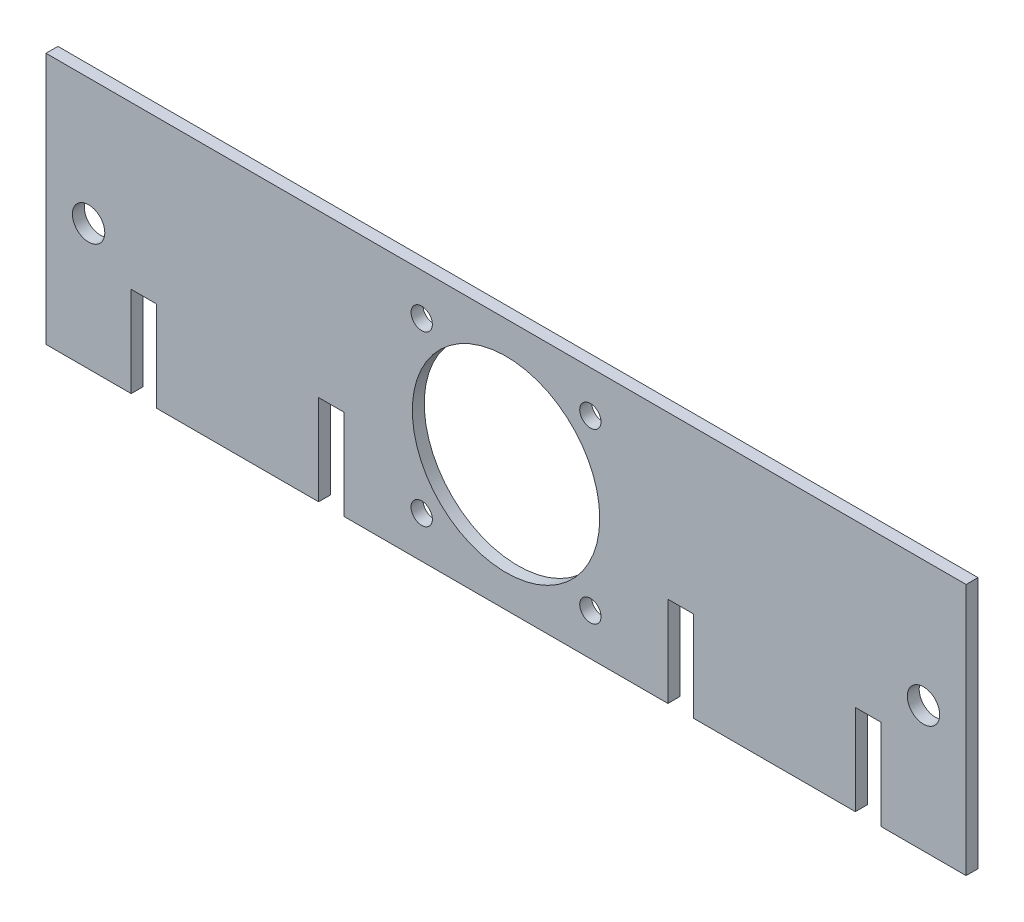
ISO-10303-21;
HEADER;
FILE_DESCRIPTION(('STEP AP214'),'2;1');
FILE_NAME('part.step','',(''),(''),'','','');
FILE_SCHEMA(('AUTOMOTIVE_DESIGN { 1 0 10303 214 1 1 1 1 }'));
ENDSEC;
DATA;
#1=APPLICATION_CONTEXT('core data for automotive mechanical design processes');
#2=APPLICATION_PROTOCOL_DEFINITION('international standard','automotive_design',2000,#1);
#3=PRODUCT_CONTEXT('',#1,'mechanical');
#4=PRODUCT('Part','Part','',(#3));
#5=PRODUCT_RELATED_PRODUCT_CATEGORY('part','',(#4));
#6=PRODUCT_DEFINITION_FORMATION('','',#4);
#7=PRODUCT_DEFINITION_CONTEXT('part definition',#1,'design');
#8=PRODUCT_DEFINITION('design','',#6,#7);
#9=PRODUCT_DEFINITION_SHAPE('','',#8);
#10=(LENGTH_UNIT() NAMED_UNIT(*) SI_UNIT(.MILLI.,.METRE.));
#11=(NAMED_UNIT(*) PLANE_ANGLE_UNIT() SI_UNIT($,.RADIAN.));
#12=(NAMED_UNIT(*) SI_UNIT($,.STERADIAN.) SOLID_ANGLE_UNIT());
#13=UNCERTAINTY_MEASURE_WITH_UNIT(LENGTH_MEASURE(1.E-05),#10,'distance_accuracy_value','');
#14=(GEOMETRIC_REPRESENTATION_CONTEXT(3) GLOBAL_UNCERTAINTY_ASSIGNED_CONTEXT((#13)) GLOBAL_UNIT_ASSIGNED_CONTEXT((#10,
#11,#12)) REPRESENTATION_CONTEXT('',''));
#15=CARTESIAN_POINT('',(0.,0.,0.));
#16=DIRECTION('',(0.,0.,1.));
#17=DIRECTION('',(1.,0.,0.));
#18=AXIS2_PLACEMENT_3D('',#15,#16,#17);
#19=CARTESIAN_POINT('',(19.,-4.2,2.4));
#20=DIRECTION('',(0.,-1.,0.));
#21=DIRECTION('',(-1.,0.,0.));
#22=AXIS2_PLACEMENT_3D('',#19,#20,#21);
#23=PLANE('',#22);
#24=DIRECTION('',(0.,0.,1.));
#25=VECTOR('',#24,1.);
#26=CARTESIAN_POINT('',(19.,-4.2,2.4));
#27=LINE('',#26,#25);
#28=CARTESIAN_POINT('',(19.,-4.2,1.));
#29=VERTEX_POINT('',#28);
#30=CARTESIAN_POINT('',(19.,-4.2,2.4));
#31=VERTEX_POINT('',#30);
#32=EDGE_CURVE('E11',#29,#31,#27,.T.);
#33=ORIENTED_EDGE('',*,*,#32,.F.);
#34=DIRECTION('',(-1.,0.,0.));
#35=VECTOR('',#34,1.);
#36=CARTESIAN_POINT('',(54.,-4.2,1.));
#37=LINE('',#36,#35);
#38=CARTESIAN_POINT('',(22.,-4.2,1.));
#39=VERTEX_POINT('',#38);
#40=EDGE_CURVE('E138',#39,#29,#37,.T.);
#41=ORIENTED_EDGE('',*,*,#40,.F.);
#42=DIRECTION('',(0.,0.,1.));
#43=VECTOR('',#42,1.);
#44=CARTESIAN_POINT('',(22.,-4.2,2.4));
#45=LINE('',#44,#43);
#46=CARTESIAN_POINT('',(22.,-4.2,2.4));
#47=VERTEX_POINT('',#46);
#48=EDGE_CURVE('E43',#39,#47,#45,.T.);
#49=ORIENTED_EDGE('',*,*,#48,.T.);
#50=DIRECTION('',(-1.,0.,0.));
#51=VECTOR('',#50,1.);
#52=CARTESIAN_POINT('',(19.,-4.2,2.4));
#53=LINE('',#52,#51);
#54=EDGE_CURVE('E269',#47,#31,#53,.T.);
#55=ORIENTED_EDGE('',*,*,#54,.T.);
#56=EDGE_LOOP('',(#33,#41,#49,#55));
#57=FACE_BOUND('',#56,.T.);
#58=ADVANCED_FACE('F33',(#57),#23,.T.);
#59=CARTESIAN_POINT('',(22.,-4.2,2.4));
#60=DIRECTION('',(-1.,0.,0.));
#61=DIRECTION('',(0.,1.,0.));
#62=AXIS2_PLACEMENT_3D('',#59,#60,#61);
#63=PLANE('',#62);
#64=ORIENTED_EDGE('',*,*,#48,.F.);
#65=DIRECTION('',(0.,1.,0.));
#66=VECTOR('',#65,1.);
#67=CARTESIAN_POINT('',(22.,14.8,1.));
#68=LINE('',#67,#66);
#69=CARTESIAN_POINT('',(22.,-14.8,1.));
#70=VERTEX_POINT('',#69);
#71=EDGE_CURVE('E193',#70,#39,#68,.T.);
#72=ORIENTED_EDGE('',*,*,#71,.F.);
#73=DIRECTION('',(0.,0.,1.));
#74=VECTOR('',#73,1.);
#75=CARTESIAN_POINT('',(22.,-14.8,2.4));
#76=LINE('',#75,#74);
#77=CARTESIAN_POINT('',(22.,-14.8,2.4));
#78=VERTEX_POINT('',#77);
#79=EDGE_CURVE('E262',#70,#78,#76,.T.);
#80=ORIENTED_EDGE('',*,*,#79,.T.);
#81=DIRECTION('',(0.,1.,0.));
#82=VECTOR('',#81,1.);
#83=CARTESIAN_POINT('',(22.,-4.2,2.4));
#84=LINE('',#83,#82);
#85=EDGE_CURVE('E280',#78,#47,#84,.T.);
#86=ORIENTED_EDGE('',*,*,#85,.T.);
#87=EDGE_LOOP('',(#64,#72,#80,#86));
#88=FACE_BOUND('',#87,.T.);
#89=ADVANCED_FACE('F283',(#88),#63,.T.);
#90=CARTESIAN_POINT('',(-54.,-14.8,2.4));
#91=DIRECTION('',(0.,1.,0.));
#92=DIRECTION('',(1.,0.,0.));
#93=AXIS2_PLACEMENT_3D('',#90,#91,#92);
#94=PLANE('',#93);
#95=ORIENTED_EDGE('',*,*,#79,.F.);
#96=DIRECTION('',(-1.,0.,0.));
#97=VECTOR('',#96,1.);
#98=CARTESIAN_POINT('',(54.,-14.8,1.));
#99=LINE('',#98,#97);
#100=CARTESIAN_POINT('',(41.,-14.8,1.));
#101=VERTEX_POINT('',#100);
#102=EDGE_CURVE('E190',#70,#101,#99,.F.);
#103=ORIENTED_EDGE('',*,*,#102,.T.);
#104=DIRECTION('',(0.,0.,1.));
#105=VECTOR('',#104,1.);
#106=CARTESIAN_POINT('',(41.,-14.8,2.4));
#107=LINE('',#106,#105);
#108=CARTESIAN_POINT('',(41.,-14.8,2.4));
#109=VERTEX_POINT('',#108);
#110=EDGE_CURVE('E259',#101,#109,#107,.T.);
#111=ORIENTED_EDGE('',*,*,#110,.T.);
#112=DIRECTION('',(1.,0.,0.));
#113=VECTOR('',#112,1.);
#114=CARTESIAN_POINT('',(-54.,-14.8,2.4));
#115=LINE('',#114,#113);
#116=EDGE_CURVE('E284',#78,#109,#115,.T.);
#117=ORIENTED_EDGE('',*,*,#116,.F.);
#118=EDGE_LOOP('',(#95,#103,#111,#117));
#119=FACE_BOUND('',#118,.T.);
#120=ADVANCED_FACE('F364',(#119),#94,.F.);
#121=CARTESIAN_POINT('',(41.,-14.8,2.4));
#122=DIRECTION('',(1.,0.,0.));
#123=DIRECTION('',(0.,-1.,0.));
#124=AXIS2_PLACEMENT_3D('',#121,#122,#123);
#125=PLANE('',#124);
#126=ORIENTED_EDGE('',*,*,#110,.F.);
#127=DIRECTION('',(0.,1.,0.));
#128=VECTOR('',#127,1.);
#129=CARTESIAN_POINT('',(41.,14.8,1.));
#130=LINE('',#129,#128);
#131=CARTESIAN_POINT('',(41.,-4.2,1.));
#132=VERTEX_POINT('',#131);
#133=EDGE_CURVE('E187',#132,#101,#130,.F.);
#134=ORIENTED_EDGE('',*,*,#133,.F.);
#135=DIRECTION('',(0.,0.,1.));
#136=VECTOR('',#135,1.);
#137=CARTESIAN_POINT('',(41.,-4.2,2.4));
#138=LINE('',#137,#136);
#139=CARTESIAN_POINT('',(41.,-4.2,2.4));
#140=VERTEX_POINT('',#139);
#141=EDGE_CURVE('E256',#132,#140,#138,.T.);
#142=ORIENTED_EDGE('',*,*,#141,.T.);
#143=DIRECTION('',(0.,-1.,0.));
#144=VECTOR('',#143,1.);
#145=CARTESIAN_POINT('',(41.,-14.8,2.4));
#146=LINE('',#145,#144);
#147=EDGE_CURVE('E286',#140,#109,#146,.T.);
#148=ORIENTED_EDGE('',*,*,#147,.T.);
#149=EDGE_LOOP('',(#126,#134,#142,#148));
#150=FACE_BOUND('',#149,.T.);
#151=ADVANCED_FACE('F559',(#150),#125,.T.);
#152=CARTESIAN_POINT('',(44.,-4.2,2.4));
#153=DIRECTION('',(0.,-1.,0.));
#154=DIRECTION('',(-1.,0.,0.));
#155=AXIS2_PLACEMENT_3D('',#152,#153,#154);
#156=PLANE('',#155);
#157=ORIENTED_EDGE('',*,*,#141,.F.);
#158=DIRECTION('',(-1.,0.,0.));
#159=VECTOR('',#158,1.);
#160=CARTESIAN_POINT('',(54.,-4.2,1.));
#161=LINE('',#160,#159);
#162=CARTESIAN_POINT('',(44.,-4.2,1.));
#163=VERTEX_POINT('',#162);
#164=EDGE_CURVE('E184',#163,#132,#161,.T.);
#165=ORIENTED_EDGE('',*,*,#164,.F.);
#166=DIRECTION('',(0.,0.,1.));
#167=VECTOR('',#166,1.);
#168=CARTESIAN_POINT('',(44.,-4.2,2.4));
#169=LINE('',#168,#167);
#170=CARTESIAN_POINT('',(44.,-4.2,2.4));
#171=VERTEX_POINT('',#170);
#172=EDGE_CURVE('E253',#163,#171,#169,.T.);
#173=ORIENTED_EDGE('',*,*,#172,.T.);
#174=DIRECTION('',(-1.,0.,0.));
#175=VECTOR('',#174,1.);
#176=CARTESIAN_POINT('',(44.,-4.2,2.4));
#177=LINE('',#176,#175);
#178=EDGE_CURVE('E293',#171,#140,#177,.T.);
#179=ORIENTED_EDGE('',*,*,#178,.T.);
#180=EDGE_LOOP('',(#157,#165,#173,#179));
#181=FACE_BOUND('',#180,.T.);
#182=ADVANCED_FACE('F549',(#181),#156,.T.);
#183=CARTESIAN_POINT('',(44.,-14.8,2.4));
#184=DIRECTION('',(-1.,0.,0.));
#185=DIRECTION('',(0.,1.,0.));
#186=AXIS2_PLACEMENT_3D('',#183,#184,#185);
#187=PLANE('',#186);
#188=ORIENTED_EDGE('',*,*,#172,.F.);
#189=DIRECTION('',(0.,1.,0.));
#190=VECTOR('',#189,1.);
#191=CARTESIAN_POINT('',(44.,14.8,1.));
#192=LINE('',#191,#190);
#193=CARTESIAN_POINT('',(44.,-14.8,1.));
#194=VERTEX_POINT('',#193);
#195=EDGE_CURVE('E181',#194,#163,#192,.T.);
#196=ORIENTED_EDGE('',*,*,#195,.F.);
#197=DIRECTION('',(0.,0.,1.));
#198=VECTOR('',#197,1.);
#199=CARTESIAN_POINT('',(44.,-14.8,2.4));
#200=LINE('',#199,#198);
#201=CARTESIAN_POINT('',(44.,-14.8,2.4));
#202=VERTEX_POINT('',#201);
#203=EDGE_CURVE('E250',#194,#202,#200,.T.);
#204=ORIENTED_EDGE('',*,*,#203,.T.);
#205=DIRECTION('',(0.,1.,0.));
#206=VECTOR('',#205,1.);
#207=CARTESIAN_POINT('',(44.,-14.8,2.4));
#208=LINE('',#207,#206);
#209=EDGE_CURVE('E296',#202,#171,#208,.T.);
#210=ORIENTED_EDGE('',*,*,#209,.T.);
#211=EDGE_LOOP('',(#188,#196,#204,#210));
#212=FACE_BOUND('',#211,.T.);
#213=ADVANCED_FACE('F540',(#212),#187,.T.);
#214=ORIENTED_EDGE('',*,*,#203,.F.);
#215=DIRECTION('',(-1.,0.,0.));
#216=VECTOR('',#215,1.);
#217=CARTESIAN_POINT('',(54.,-14.8,1.));
#218=LINE('',#217,#216);
#219=CARTESIAN_POINT('',(54.,-14.8,1.));
#220=VERTEX_POINT('',#219);
#221=EDGE_CURVE('E178',#194,#220,#218,.F.);
#222=ORIENTED_EDGE('',*,*,#221,.T.);
#223=DIRECTION('',(0.,0.,1.));
#224=VECTOR('',#223,1.);
#225=CARTESIAN_POINT('',(54.,-14.8,2.4));
#226=LINE('',#225,#224);
#227=CARTESIAN_POINT('',(54.,-14.8,2.4));
#228=VERTEX_POINT('',#227);
#229=EDGE_CURVE('E247',#220,#228,#226,.T.);
#230=ORIENTED_EDGE('',*,*,#229,.T.);
#231=EDGE_CURVE('E288',#202,#228,#115,.T.);
#232=ORIENTED_EDGE('',*,*,#231,.F.);
#233=EDGE_LOOP('',(#214,#222,#230,#232));
#234=FACE_BOUND('',#233,.T.);
#235=ADVANCED_FACE('F503',(#234),#94,.F.);
#236=CARTESIAN_POINT('',(54.,-14.8,2.4));
#237=DIRECTION('',(-1.,0.,0.));
#238=DIRECTION('',(0.,1.,0.));
#239=AXIS2_PLACEMENT_3D('',#236,#237,#238);
#240=PLANE('',#239);
#241=ORIENTED_EDGE('',*,*,#229,.F.);
#242=DIRECTION('',(0.,1.,0.));
#243=VECTOR('',#242,1.);
#244=CARTESIAN_POINT('',(54.,14.8,1.));
#245=LINE('',#244,#243);
#246=CARTESIAN_POINT('',(54.,14.8,1.));
#247=VERTEX_POINT('',#246);
#248=EDGE_CURVE('E175',#220,#247,#245,.T.);
#249=ORIENTED_EDGE('',*,*,#248,.T.);
#250=DIRECTION('',(0.,0.,1.));
#251=VECTOR('',#250,1.);
#252=CARTESIAN_POINT('',(54.,14.8,2.4));
#253=LINE('',#252,#251);
#254=CARTESIAN_POINT('',(54.,14.8,2.4));
#255=VERTEX_POINT('',#254);
#256=EDGE_CURVE('E244',#247,#255,#253,.T.);
#257=ORIENTED_EDGE('',*,*,#256,.T.);
#258=DIRECTION('',(0.,1.,0.));
#259=VECTOR('',#258,1.);
#260=CARTESIAN_POINT('',(54.,-14.8,2.4));
#261=LINE('',#260,#259);
#262=EDGE_CURVE('E299',#228,#255,#261,.T.);
#263=ORIENTED_EDGE('',*,*,#262,.F.);
#264=EDGE_LOOP('',(#241,#249,#257,#263));
#265=FACE_BOUND('',#264,.T.);
#266=ADVANCED_FACE('F521',(#265),#240,.F.);
#267=CARTESIAN_POINT('',(-54.,14.8,2.4));
#268=DIRECTION('',(0.,-1.,0.));
#269=DIRECTION('',(-1.,0.,0.));
#270=AXIS2_PLACEMENT_3D('',#267,#268,#269);
#271=PLANE('',#270);
#272=ORIENTED_EDGE('',*,*,#256,.F.);
#273=DIRECTION('',(-1.,0.,0.));
#274=VECTOR('',#273,1.);
#275=CARTESIAN_POINT('',(54.,14.8,1.));
#276=LINE('',#275,#274);
#277=CARTESIAN_POINT('',(-54.,14.8,1.));
#278=VERTEX_POINT('',#277);
#279=EDGE_CURVE('E172',#247,#278,#276,.T.);
#280=ORIENTED_EDGE('',*,*,#279,.T.);
#281=DIRECTION('',(0.,0.,1.));
#282=VECTOR('',#281,1.);
#283=CARTESIAN_POINT('',(-54.,14.8,2.4));
#284=LINE('',#283,#282);
#285=CARTESIAN_POINT('',(-54.,14.8,2.4));
#286=VERTEX_POINT('',#285);
#287=EDGE_CURVE('E241',#278,#286,#284,.T.);
#288=ORIENTED_EDGE('',*,*,#287,.T.);
#289=DIRECTION('',(-1.,0.,0.));
#290=VECTOR('',#289,1.);
#291=CARTESIAN_POINT('',(-54.,14.8,2.4));
#292=LINE('',#291,#290);
#293=EDGE_CURVE('E302',#255,#286,#292,.T.);
#294=ORIENTED_EDGE('',*,*,#293,.F.);
#295=EDGE_LOOP('',(#272,#280,#288,#294));
#296=FACE_BOUND('',#295,.T.);
#297=ADVANCED_FACE('F511',(#296),#271,.F.);
#298=CARTESIAN_POINT('',(-54.,-14.8,2.4));
#299=DIRECTION('',(1.,0.,0.));
#300=DIRECTION('',(0.,-1.,0.));
#301=AXIS2_PLACEMENT_3D('',#298,#299,#300);
#302=PLANE('',#301);
#303=ORIENTED_EDGE('',*,*,#287,.F.);
#304=DIRECTION('',(0.,1.,0.));
#305=VECTOR('',#304,1.);
#306=CARTESIAN_POINT('',(-54.,14.8,1.));
#307=LINE('',#306,#305);
#308=CARTESIAN_POINT('',(-54.,-14.8,1.));
#309=VERTEX_POINT('',#308);
#310=EDGE_CURVE('E169',#278,#309,#307,.F.);
#311=ORIENTED_EDGE('',*,*,#310,.T.);
#312=DIRECTION('',(0.,0.,1.));
#313=VECTOR('',#312,1.);
#314=CARTESIAN_POINT('',(-54.,-14.8,2.4));
#315=LINE('',#314,#313);
#316=CARTESIAN_POINT('',(-54.,-14.8,2.4));
#317=VERTEX_POINT('',#316);
#318=EDGE_CURVE('E238',#309,#317,#315,.T.);
#319=ORIENTED_EDGE('',*,*,#318,.T.);
#320=DIRECTION('',(0.,-1.,0.));
#321=VECTOR('',#320,1.);
#322=CARTESIAN_POINT('',(-54.,-14.8,2.4));
#323=LINE('',#322,#321);
#324=EDGE_CURVE('E305',#286,#317,#323,.T.);
#325=ORIENTED_EDGE('',*,*,#324,.F.);
#326=EDGE_LOOP('',(#303,#311,#319,#325));
#327=FACE_BOUND('',#326,.T.);
#328=ADVANCED_FACE('F501',(#327),#302,.F.);
#329=ORIENTED_EDGE('',*,*,#318,.F.);
#330=DIRECTION('',(-1.,0.,0.));
#331=VECTOR('',#330,1.);
#332=CARTESIAN_POINT('',(54.,-14.8,1.));
#333=LINE('',#332,#331);
#334=CARTESIAN_POINT('',(-44.,-14.8,1.));
#335=VERTEX_POINT('',#334);
#336=EDGE_CURVE('E166',#309,#335,#333,.F.);
#337=ORIENTED_EDGE('',*,*,#336,.T.);
#338=DIRECTION('',(0.,0.,1.));
#339=VECTOR('',#338,1.);
#340=CARTESIAN_POINT('',(-44.,-14.8,2.4));
#341=LINE('',#340,#339);
#342=CARTESIAN_POINT('',(-44.,-14.8,2.4));
#343=VERTEX_POINT('',#342);
#344=EDGE_CURVE('E235',#335,#343,#341,.T.);
#345=ORIENTED_EDGE('',*,*,#344,.T.);
#346=EDGE_CURVE('E308',#317,#343,#115,.T.);
#347=ORIENTED_EDGE('',*,*,#346,.F.);
#348=EDGE_LOOP('',(#329,#337,#345,#347));
#349=FACE_BOUND('',#348,.T.);
#350=ADVANCED_FACE('F464',(#349),#94,.F.);
#351=CARTESIAN_POINT('',(-44.,-4.2,2.4));
#352=DIRECTION('',(1.,0.,0.));
#353=DIRECTION('',(0.,-1.,0.));
#354=AXIS2_PLACEMENT_3D('',#351,#352,#353);
#355=PLANE('',#354);
#356=ORIENTED_EDGE('',*,*,#344,.F.);
#357=DIRECTION('',(0.,1.,0.));
#358=VECTOR('',#357,1.);
#359=CARTESIAN_POINT('',(-44.,14.8,1.));
#360=LINE('',#359,#358);
#361=CARTESIAN_POINT('',(-44.,-4.2,1.));
#362=VERTEX_POINT('',#361);
#363=EDGE_CURVE('E163',#362,#335,#360,.F.);
#364=ORIENTED_EDGE('',*,*,#363,.F.);
#365=DIRECTION('',(0.,0.,1.));
#366=VECTOR('',#365,1.);
#367=CARTESIAN_POINT('',(-44.,-4.2,2.4));
#368=LINE('',#367,#366);
#369=CARTESIAN_POINT('',(-44.,-4.2,2.4));
#370=VERTEX_POINT('',#369);
#371=EDGE_CURVE('E232',#362,#370,#368,.T.);
#372=ORIENTED_EDGE('',*,*,#371,.T.);
#373=DIRECTION('',(0.,-1.,0.));
#374=VECTOR('',#373,1.);
#375=CARTESIAN_POINT('',(-44.,-4.2,2.4));
#376=LINE('',#375,#374);
#377=EDGE_CURVE('E309',#370,#343,#376,.T.);
#378=ORIENTED_EDGE('',*,*,#377,.T.);
#379=EDGE_LOOP('',(#356,#364,#372,#378));
#380=FACE_BOUND('',#379,.T.);
#381=ADVANCED_FACE('F482',(#380),#355,.T.);
#382=CARTESIAN_POINT('',(-44.,-4.2,2.4));
#383=DIRECTION('',(0.,-1.,0.));
#384=DIRECTION('',(-1.,0.,0.));
#385=AXIS2_PLACEMENT_3D('',#382,#383,#384);
#386=PLANE('',#385);
#387=ORIENTED_EDGE('',*,*,#371,.F.);
#388=DIRECTION('',(-1.,0.,0.));
#389=VECTOR('',#388,1.);
#390=CARTESIAN_POINT('',(54.,-4.2,1.));
#391=LINE('',#390,#389);
#392=CARTESIAN_POINT('',(-41.,-4.2,1.));
#393=VERTEX_POINT('',#392);
#394=EDGE_CURVE('E160',#393,#362,#391,.T.);
#395=ORIENTED_EDGE('',*,*,#394,.F.);
#396=DIRECTION('',(0.,0.,1.));
#397=VECTOR('',#396,1.);
#398=CARTESIAN_POINT('',(-41.,-4.2,2.4));
#399=LINE('',#398,#397);
#400=CARTESIAN_POINT('',(-41.,-4.2,2.4));
#401=VERTEX_POINT('',#400);
#402=EDGE_CURVE('E229',#393,#401,#399,.T.);
#403=ORIENTED_EDGE('',*,*,#402,.T.);
#404=DIRECTION('',(-1.,0.,0.));
#405=VECTOR('',#404,1.);
#406=CARTESIAN_POINT('',(-44.,-4.2,2.4));
#407=LINE('',#406,#405);
#408=EDGE_CURVE('E312',#401,#370,#407,.T.);
#409=ORIENTED_EDGE('',*,*,#408,.T.);
#410=EDGE_LOOP('',(#387,#395,#403,#409));
#411=FACE_BOUND('',#410,.T.);
#412=ADVANCED_FACE('F472',(#411),#386,.T.);
#413=CARTESIAN_POINT('',(-41.,-4.2,2.4));
#414=DIRECTION('',(-1.,0.,0.));
#415=DIRECTION('',(0.,1.,0.));
#416=AXIS2_PLACEMENT_3D('',#413,#414,#415);
#417=PLANE('',#416);
#418=ORIENTED_EDGE('',*,*,#402,.F.);
#419=DIRECTION('',(0.,1.,0.));
#420=VECTOR('',#419,1.);
#421=CARTESIAN_POINT('',(-41.,14.8,1.));
#422=LINE('',#421,#420);
#423=CARTESIAN_POINT('',(-41.,-14.8,1.));
#424=VERTEX_POINT('',#423);
#425=EDGE_CURVE('E157',#424,#393,#422,.T.);
#426=ORIENTED_EDGE('',*,*,#425,.F.);
#427=DIRECTION('',(0.,0.,1.));
#428=VECTOR('',#427,1.);
#429=CARTESIAN_POINT('',(-41.,-14.8,2.4));
#430=LINE('',#429,#428);
#431=CARTESIAN_POINT('',(-41.,-14.8,2.4));
#432=VERTEX_POINT('',#431);
#433=EDGE_CURVE('E226',#424,#432,#430,.T.);
#434=ORIENTED_EDGE('',*,*,#433,.T.);
#435=DIRECTION('',(0.,1.,0.));
#436=VECTOR('',#435,1.);
#437=CARTESIAN_POINT('',(-41.,-4.2,2.4));
#438=LINE('',#437,#436);
#439=EDGE_CURVE('E315',#432,#401,#438,.T.);
#440=ORIENTED_EDGE('',*,*,#439,.T.);
#441=EDGE_LOOP('',(#418,#426,#434,#440));
#442=FACE_BOUND('',#441,.T.);
#443=ADVANCED_FACE('F462',(#442),#417,.T.);
#444=ORIENTED_EDGE('',*,*,#433,.F.);
#445=DIRECTION('',(-1.,0.,0.));
#446=VECTOR('',#445,1.);
#447=CARTESIAN_POINT('',(54.,-14.8,1.));
#448=LINE('',#447,#446);
#449=CARTESIAN_POINT('',(-22.,-14.8,1.));
#450=VERTEX_POINT('',#449);
#451=EDGE_CURVE('E154',#424,#450,#448,.F.);
#452=ORIENTED_EDGE('',*,*,#451,.T.);
#453=DIRECTION('',(0.,0.,1.));
#454=VECTOR('',#453,1.);
#455=CARTESIAN_POINT('',(-22.,-14.8,2.4));
#456=LINE('',#455,#454);
#457=CARTESIAN_POINT('',(-22.,-14.8,2.4));
#458=VERTEX_POINT('',#457);
#459=EDGE_CURVE('E223',#450,#458,#456,.T.);
#460=ORIENTED_EDGE('',*,*,#459,.T.);
#461=EDGE_CURVE('E318',#432,#458,#115,.T.);
#462=ORIENTED_EDGE('',*,*,#461,.F.);
#463=EDGE_LOOP('',(#444,#452,#460,#462));
#464=FACE_BOUND('',#463,.T.);
#465=ADVANCED_FACE('F365',(#464),#94,.F.);
#466=CARTESIAN_POINT('',(-22.,-4.2,2.4));
#467=DIRECTION('',(1.,0.,0.));
#468=DIRECTION('',(0.,-1.,0.));
#469=AXIS2_PLACEMENT_3D('',#466,#467,#468);
#470=PLANE('',#469);
#471=ORIENTED_EDGE('',*,*,#459,.F.);
#472=DIRECTION('',(0.,1.,0.));
#473=VECTOR('',#472,1.);
#474=CARTESIAN_POINT('',(-22.,14.8,1.));
#475=LINE('',#474,#473);
#476=CARTESIAN_POINT('',(-22.,-4.2,1.));
#477=VERTEX_POINT('',#476);
#478=EDGE_CURVE('E151',#477,#450,#475,.F.);
#479=ORIENTED_EDGE('',*,*,#478,.F.);
#480=DIRECTION('',(0.,0.,1.));
#481=VECTOR('',#480,1.);
#482=CARTESIAN_POINT('',(-22.,-4.2,2.4));
#483=LINE('',#482,#481);
#484=CARTESIAN_POINT('',(-22.,-4.2,2.4));
#485=VERTEX_POINT('',#484);
#486=EDGE_CURVE('E220',#477,#485,#483,.T.);
#487=ORIENTED_EDGE('',*,*,#486,.T.);
#488=DIRECTION('',(0.,-1.,0.));
#489=VECTOR('',#488,1.);
#490=CARTESIAN_POINT('',(-22.,-4.2,2.4));
#491=LINE('',#490,#489);
#492=EDGE_CURVE('E319',#485,#458,#491,.T.);
#493=ORIENTED_EDGE('',*,*,#492,.T.);
#494=EDGE_LOOP('',(#471,#479,#487,#493));
#495=FACE_BOUND('',#494,.T.);
#496=ADVANCED_FACE('F443',(#495),#470,.T.);
#497=CARTESIAN_POINT('',(-22.,-4.2,2.4));
#498=DIRECTION('',(0.,-1.,0.));
#499=DIRECTION('',(-1.,0.,0.));
#500=AXIS2_PLACEMENT_3D('',#497,#498,#499);
#501=PLANE('',#500);
#502=ORIENTED_EDGE('',*,*,#486,.F.);
#503=DIRECTION('',(-1.,0.,0.));
#504=VECTOR('',#503,1.);
#505=CARTESIAN_POINT('',(54.,-4.2,1.));
#506=LINE('',#505,#504);
#507=CARTESIAN_POINT('',(-19.,-4.2,1.));
#508=VERTEX_POINT('',#507);
#509=EDGE_CURVE('E148',#508,#477,#506,.T.);
#510=ORIENTED_EDGE('',*,*,#509,.F.);
#511=DIRECTION('',(0.,0.,1.));
#512=VECTOR('',#511,1.);
#513=CARTESIAN_POINT('',(-19.,-4.2,2.4));
#514=LINE('',#513,#512);
#515=CARTESIAN_POINT('',(-19.,-4.2,2.4));
#516=VERTEX_POINT('',#515);
#517=EDGE_CURVE('E218',#508,#516,#514,.T.);
#518=ORIENTED_EDGE('',*,*,#517,.T.);
#519=DIRECTION('',(-1.,0.,0.));
#520=VECTOR('',#519,1.);
#521=CARTESIAN_POINT('',(-22.,-4.2,2.4));
#522=LINE('',#521,#520);
#523=EDGE_CURVE('E322',#516,#485,#522,.T.);
#524=ORIENTED_EDGE('',*,*,#523,.T.);
#525=EDGE_LOOP('',(#502,#510,#518,#524));
#526=FACE_BOUND('',#525,.T.);
#527=ADVANCED_FACE('F434',(#526),#501,.T.);
#528=CARTESIAN_POINT('',(-19.,-4.2,2.4));
#529=DIRECTION('',(-1.,0.,0.));
#530=DIRECTION('',(0.,1.,0.));
#531=AXIS2_PLACEMENT_3D('',#528,#529,#530);
#532=PLANE('',#531);
#533=ORIENTED_EDGE('',*,*,#517,.F.);
#534=DIRECTION('',(0.,1.,0.));
#535=VECTOR('',#534,1.);
#536=CARTESIAN_POINT('',(-19.,14.8,1.));
#537=LINE('',#536,#535);
#538=CARTESIAN_POINT('',(-19.,-14.8,1.));
#539=VERTEX_POINT('',#538);
#540=EDGE_CURVE('E145',#539,#508,#537,.T.);
#541=ORIENTED_EDGE('',*,*,#540,.F.);
#542=DIRECTION('',(0.,0.,1.));
#543=VECTOR('',#542,1.);
#544=CARTESIAN_POINT('',(-19.,-14.8,2.4));
#545=LINE('',#544,#543);
#546=CARTESIAN_POINT('',(-19.,-14.8,2.4));
#547=VERTEX_POINT('',#546);
#548=EDGE_CURVE('E51',#539,#547,#545,.T.);
#549=ORIENTED_EDGE('',*,*,#548,.T.);
#550=DIRECTION('',(0.,1.,0.));
#551=VECTOR('',#550,1.);
#552=CARTESIAN_POINT('',(-19.,-4.2,2.4));
#553=LINE('',#552,#551);
#554=EDGE_CURVE('E325',#547,#516,#553,.T.);
#555=ORIENTED_EDGE('',*,*,#554,.T.);
#556=EDGE_LOOP('',(#533,#541,#549,#555));
#557=FACE_BOUND('',#556,.T.);
#558=ADVANCED_FACE('F362',(#557),#532,.T.);
#559=ORIENTED_EDGE('',*,*,#548,.F.);
#560=DIRECTION('',(-1.,0.,0.));
#561=VECTOR('',#560,1.);
#562=CARTESIAN_POINT('',(54.,-14.8,1.));
#563=LINE('',#562,#561);
#564=CARTESIAN_POINT('',(19.,-14.8,1.));
#565=VERTEX_POINT('',#564);
#566=EDGE_CURVE('E136',#539,#565,#563,.F.);
#567=ORIENTED_EDGE('',*,*,#566,.T.);
#568=DIRECTION('',(0.,0.,1.));
#569=VECTOR('',#568,1.);
#570=CARTESIAN_POINT('',(19.,-14.8,2.4));
#571=LINE('',#570,#569);
#572=CARTESIAN_POINT('',(19.,-14.8,2.4));
#573=VERTEX_POINT('',#572);
#574=EDGE_CURVE('E37',#565,#573,#571,.T.);
#575=ORIENTED_EDGE('',*,*,#574,.T.);
#576=EDGE_CURVE('E216',#547,#573,#115,.T.);
#577=ORIENTED_EDGE('',*,*,#576,.F.);
#578=EDGE_LOOP('',(#559,#567,#575,#577));
#579=FACE_BOUND('',#578,.T.);
#580=ADVANCED_FACE('F140',(#579),#94,.F.);
#581=CARTESIAN_POINT('',(19.,-4.2,2.4));
#582=DIRECTION('',(1.,0.,0.));
#583=DIRECTION('',(0.,-1.,0.));
#584=AXIS2_PLACEMENT_3D('',#581,#582,#583);
#585=PLANE('',#584);
#586=DIRECTION('',(0.,1.,0.));
#587=VECTOR('',#586,1.);
#588=CARTESIAN_POINT('',(19.,14.8,1.));
#589=LINE('',#588,#587);
#590=EDGE_CURVE('E124',#29,#565,#589,.F.);
#591=ORIENTED_EDGE('',*,*,#590,.F.);
#592=ORIENTED_EDGE('',*,*,#32,.T.);
#593=DIRECTION('',(0.,-1.,0.));
#594=VECTOR('',#593,1.);
#595=CARTESIAN_POINT('',(19.,-4.2,2.4));
#596=LINE('',#595,#594);
#597=EDGE_CURVE('E126',#31,#573,#596,.T.);
#598=ORIENTED_EDGE('',*,*,#597,.T.);
#599=ORIENTED_EDGE('',*,*,#574,.F.);
#600=EDGE_LOOP('',(#591,#592,#598,#599));
#601=FACE_BOUND('',#600,.T.);
#602=ADVANCED_FACE('F123',(#601),#585,.T.);
#603=CARTESIAN_POINT('',(0.,0.,2.4));
#604=DIRECTION('',(0.,0.,1.));
#605=DIRECTION('',(1.,0.,0.));
#606=AXIS2_PLACEMENT_3D('',#603,#604,#605);
#607=CYLINDRICAL_SURFACE('',#606,10.999999971);
#608=CARTESIAN_POINT('',(0.,0.,2.4));
#609=DIRECTION('',(0.,0.,1.));
#610=DIRECTION('',(1.,0.,0.));
#611=AXIS2_PLACEMENT_3D('',#608,#609,#610);
#612=CIRCLE('',#611,10.999999971);
#613=CARTESIAN_POINT('',(10.999999971,0.,2.4));
#614=VERTEX_POINT('',#613);
#615=EDGE_CURVE('E327',#614,#614,#612,.T.);
#616=ORIENTED_EDGE('',*,*,#615,.T.);
#617=EDGE_LOOP('',(#616));
#618=FACE_BOUND('',#617,.T.);
#619=CARTESIAN_POINT('',(0.,0.,1.));
#620=DIRECTION('',(0.,0.,1.));
#621=DIRECTION('',(1.,0.,0.));
#622=AXIS2_PLACEMENT_3D('',#619,#620,#621);
#623=CIRCLE('',#622,10.999999971);
#624=CARTESIAN_POINT('',(10.999999971,0.,1.));
#625=VERTEX_POINT('',#624);
#626=EDGE_CURVE('E147',#625,#625,#623,.T.);
#627=ORIENTED_EDGE('',*,*,#626,.F.);
#628=EDGE_LOOP('',(#627));
#629=FACE_BOUND('',#628,.T.);
#630=ADVANCED_FACE('F377',(#618,#629),#607,.F.);
#631=CARTESIAN_POINT('',(49.,0.,2.4));
#632=DIRECTION('',(0.,0.,1.));
#633=DIRECTION('',(1.,0.,0.));
#634=AXIS2_PLACEMENT_3D('',#631,#632,#633);
#635=CYLINDRICAL_SURFACE('',#634,1.90000001);
#636=CARTESIAN_POINT('',(49.,0.,2.4));
#637=DIRECTION('',(0.,0.,1.));
#638=DIRECTION('',(1.,0.,0.));
#639=AXIS2_PLACEMENT_3D('',#636,#637,#638);
#640=CIRCLE('',#639,1.90000001);
#641=CARTESIAN_POINT('',(50.90000001,0.,2.4));
#642=VERTEX_POINT('',#641);
#643=EDGE_CURVE('E330',#642,#642,#640,.T.);
#644=ORIENTED_EDGE('',*,*,#643,.T.);
#645=EDGE_LOOP('',(#644));
#646=FACE_BOUND('',#645,.T.);
#647=CARTESIAN_POINT('',(49.,0.,1.));
#648=DIRECTION('',(0.,0.,1.));
#649=DIRECTION('',(1.,0.,0.));
#650=AXIS2_PLACEMENT_3D('',#647,#648,#649);
#651=CIRCLE('',#650,1.90000001);
#652=CARTESIAN_POINT('',(50.90000001,0.,1.));
#653=VERTEX_POINT('',#652);
#654=EDGE_CURVE('E198',#653,#653,#651,.T.);
#655=ORIENTED_EDGE('',*,*,#654,.F.);
#656=EDGE_LOOP('',(#655));
#657=FACE_BOUND('',#656,.T.);
#658=ADVANCED_FACE('F380',(#646,#657),#635,.F.);
#659=CARTESIAN_POINT('',(-49.,0.,2.4));
#660=DIRECTION('',(0.,0.,1.));
#661=DIRECTION('',(1.,0.,0.));
#662=AXIS2_PLACEMENT_3D('',#659,#660,#661);
#663=CYLINDRICAL_SURFACE('',#662,1.90000001);
#664=CARTESIAN_POINT('',(-49.,0.,2.4));
#665=DIRECTION('',(0.,0.,1.));
#666=DIRECTION('',(1.,0.,0.));
#667=AXIS2_PLACEMENT_3D('',#664,#665,#666);
#668=CIRCLE('',#667,1.90000001);
#669=CARTESIAN_POINT('',(-47.09999999,0.,2.4));
#670=VERTEX_POINT('',#669);
#671=EDGE_CURVE('E333',#670,#670,#668,.T.);
#672=ORIENTED_EDGE('',*,*,#671,.T.);
#673=EDGE_LOOP('',(#672));
#674=FACE_BOUND('',#673,.T.);
#675=CARTESIAN_POINT('',(-49.,0.,1.));
#676=DIRECTION('',(0.,0.,1.));
#677=DIRECTION('',(1.,0.,0.));
#678=AXIS2_PLACEMENT_3D('',#675,#676,#677);
#679=CIRCLE('',#678,1.90000001);
#680=CARTESIAN_POINT('',(-47.09999999,0.,1.));
#681=VERTEX_POINT('',#680);
#682=EDGE_CURVE('E201',#681,#681,#679,.T.);
#683=ORIENTED_EDGE('',*,*,#682,.F.);
#684=EDGE_LOOP('',(#683));
#685=FACE_BOUND('',#684,.T.);
#686=ADVANCED_FACE('F384',(#674,#685),#663,.F.);
#687=CARTESIAN_POINT('',(9.9,-9.9,2.4));
#688=DIRECTION('',(0.,0.,1.));
#689=DIRECTION('',(1.,0.,0.));
#690=AXIS2_PLACEMENT_3D('',#687,#688,#689);
#691=CYLINDRICAL_SURFACE('',#690,1.25);
#692=CARTESIAN_POINT('',(9.9,-9.9,2.4));
#693=DIRECTION('',(0.,0.,1.));
#694=DIRECTION('',(1.,0.,0.));
#695=AXIS2_PLACEMENT_3D('',#692,#693,#694);
#696=CIRCLE('',#695,1.25);
#697=CARTESIAN_POINT('',(11.15,-9.9,2.4));
#698=VERTEX_POINT('',#697);
#699=EDGE_CURVE('E336',#698,#698,#696,.T.);
#700=ORIENTED_EDGE('',*,*,#699,.T.);
#701=EDGE_LOOP('',(#700));
#702=FACE_BOUND('',#701,.T.);
#703=CARTESIAN_POINT('',(9.9,-9.9,1.));
#704=DIRECTION('',(0.,0.,1.));
#705=DIRECTION('',(1.,0.,0.));
#706=AXIS2_PLACEMENT_3D('',#703,#704,#705);
#707=CIRCLE('',#706,1.25);
#708=CARTESIAN_POINT('',(11.15,-9.9,1.));
#709=VERTEX_POINT('',#708);
#710=EDGE_CURVE('E204',#709,#709,#707,.T.);
#711=ORIENTED_EDGE('',*,*,#710,.F.);
#712=EDGE_LOOP('',(#711));
#713=FACE_BOUND('',#712,.T.);
#714=ADVANCED_FACE('F388',(#702,#713),#691,.F.);
#715=CARTESIAN_POINT('',(-9.9,9.9,2.4));
#716=DIRECTION('',(0.,0.,1.));
#717=DIRECTION('',(1.,0.,0.));
#718=AXIS2_PLACEMENT_3D('',#715,#716,#717);
#719=CYLINDRICAL_SURFACE('',#718,1.25);
#720=CARTESIAN_POINT('',(-9.9,9.9,2.4));
#721=DIRECTION('',(0.,0.,1.));
#722=DIRECTION('',(1.,0.,0.));
#723=AXIS2_PLACEMENT_3D('',#720,#721,#722);
#724=CIRCLE('',#723,1.25);
#725=CARTESIAN_POINT('',(-8.65,9.9,2.4));
#726=VERTEX_POINT('',#725);
#727=EDGE_CURVE('E339',#726,#726,#724,.T.);
#728=ORIENTED_EDGE('',*,*,#727,.T.);
#729=EDGE_LOOP('',(#728));
#730=FACE_BOUND('',#729,.T.);
#731=CARTESIAN_POINT('',(-9.9,9.9,1.));
#732=DIRECTION('',(0.,0.,1.));
#733=DIRECTION('',(1.,0.,0.));
#734=AXIS2_PLACEMENT_3D('',#731,#732,#733);
#735=CIRCLE('',#734,1.25);
#736=CARTESIAN_POINT('',(-8.65,9.9,1.));
#737=VERTEX_POINT('',#736);
#738=EDGE_CURVE('E207',#737,#737,#735,.T.);
#739=ORIENTED_EDGE('',*,*,#738,.F.);
#740=EDGE_LOOP('',(#739));
#741=FACE_BOUND('',#740,.T.);
#742=ADVANCED_FACE('F392',(#730,#741),#719,.F.);
#743=CARTESIAN_POINT('',(9.9,9.9,2.4));
#744=DIRECTION('',(0.,0.,1.));
#745=DIRECTION('',(1.,0.,0.));
#746=AXIS2_PLACEMENT_3D('',#743,#744,#745);
#747=CYLINDRICAL_SURFACE('',#746,1.24999999999999);
#748=CARTESIAN_POINT('',(9.9,9.9,2.4));
#749=DIRECTION('',(0.,0.,1.));
#750=DIRECTION('',(1.,0.,0.));
#751=AXIS2_PLACEMENT_3D('',#748,#749,#750);
#752=CIRCLE('',#751,1.24999999999999);
#753=CARTESIAN_POINT('',(11.15,9.9,2.4));
#754=VERTEX_POINT('',#753);
#755=EDGE_CURVE('E341',#754,#754,#752,.T.);
#756=ORIENTED_EDGE('',*,*,#755,.T.);
#757=EDGE_LOOP('',(#756));
#758=FACE_BOUND('',#757,.T.);
#759=CARTESIAN_POINT('',(9.9,9.9,1.));
#760=DIRECTION('',(0.,0.,1.));
#761=DIRECTION('',(1.,0.,0.));
#762=AXIS2_PLACEMENT_3D('',#759,#760,#761);
#763=CIRCLE('',#762,1.24999999999999);
#764=CARTESIAN_POINT('',(11.15,9.9,1.));
#765=VERTEX_POINT('',#764);
#766=EDGE_CURVE('E210',#765,#765,#763,.T.);
#767=ORIENTED_EDGE('',*,*,#766,.F.);
#768=EDGE_LOOP('',(#767));
#769=FACE_BOUND('',#768,.T.);
#770=ADVANCED_FACE('F360',(#758,#769),#747,.F.);
#771=CARTESIAN_POINT('',(-9.9,-9.9,2.4));
#772=DIRECTION('',(0.,0.,1.));
#773=DIRECTION('',(1.,0.,0.));
#774=AXIS2_PLACEMENT_3D('',#771,#772,#773);
#775=CYLINDRICAL_SURFACE('',#774,1.24999999999999);
#776=CARTESIAN_POINT('',(-9.9,-9.9,2.4));
#777=DIRECTION('',(0.,0.,1.));
#778=DIRECTION('',(1.,0.,0.));
#779=AXIS2_PLACEMENT_3D('',#776,#777,#778);
#780=CIRCLE('',#779,1.24999999999999);
#781=CARTESIAN_POINT('',(-8.65000000000001,-9.9,2.4));
#782=VERTEX_POINT('',#781);
#783=EDGE_CURVE('E130',#782,#782,#780,.T.);
#784=ORIENTED_EDGE('',*,*,#783,.T.);
#785=EDGE_LOOP('',(#784));
#786=FACE_BOUND('',#785,.T.);
#787=CARTESIAN_POINT('',(-9.9,-9.9,1.));
#788=DIRECTION('',(0.,0.,1.));
#789=DIRECTION('',(1.,0.,0.));
#790=AXIS2_PLACEMENT_3D('',#787,#788,#789);
#791=CIRCLE('',#790,1.24999999999999);
#792=CARTESIAN_POINT('',(-8.65000000000001,-9.9,1.));
#793=VERTEX_POINT('',#792);
#794=EDGE_CURVE('E213',#793,#793,#791,.T.);
#795=ORIENTED_EDGE('',*,*,#794,.F.);
#796=EDGE_LOOP('',(#795));
#797=FACE_BOUND('',#796,.T.);
#798=ADVANCED_FACE('F35',(#786,#797),#775,.F.);
#799=CARTESIAN_POINT('',(54.,14.8,2.4));
#800=DIRECTION('',(0.,0.,-1.));
#801=DIRECTION('',(-1.,0.,0.));
#802=AXIS2_PLACEMENT_3D('',#799,#800,#801);
#803=PLANE('',#802);
#804=ORIENTED_EDGE('',*,*,#576,.T.);
#805=ORIENTED_EDGE('',*,*,#597,.F.);
#806=ORIENTED_EDGE('',*,*,#54,.F.);
#807=ORIENTED_EDGE('',*,*,#85,.F.);
#808=ORIENTED_EDGE('',*,*,#116,.T.);
#809=ORIENTED_EDGE('',*,*,#147,.F.);
#810=ORIENTED_EDGE('',*,*,#178,.F.);
#811=ORIENTED_EDGE('',*,*,#209,.F.);
#812=ORIENTED_EDGE('',*,*,#231,.T.);
#813=ORIENTED_EDGE('',*,*,#262,.T.);
#814=ORIENTED_EDGE('',*,*,#293,.T.);
#815=ORIENTED_EDGE('',*,*,#324,.T.);
#816=ORIENTED_EDGE('',*,*,#346,.T.);
#817=ORIENTED_EDGE('',*,*,#377,.F.);
#818=ORIENTED_EDGE('',*,*,#408,.F.);
#819=ORIENTED_EDGE('',*,*,#439,.F.);
#820=ORIENTED_EDGE('',*,*,#461,.T.);
#821=ORIENTED_EDGE('',*,*,#492,.F.);
#822=ORIENTED_EDGE('',*,*,#523,.F.);
#823=ORIENTED_EDGE('',*,*,#554,.F.);
#824=EDGE_LOOP('',(#804,#805,#806,#807,#808,#809,#810,#811,#812,#813,#814,#815,#816,#817,#818,
#819,#820,#821,#822,#823));
#825=FACE_BOUND('',#824,.T.);
#826=ORIENTED_EDGE('',*,*,#615,.F.);
#827=EDGE_LOOP('',(#826));
#828=FACE_BOUND('',#827,.T.);
#829=ORIENTED_EDGE('',*,*,#643,.F.);
#830=EDGE_LOOP('',(#829));
#831=FACE_BOUND('',#830,.T.);
#832=ORIENTED_EDGE('',*,*,#671,.F.);
#833=EDGE_LOOP('',(#832));
#834=FACE_BOUND('',#833,.T.);
#835=ORIENTED_EDGE('',*,*,#699,.F.);
#836=EDGE_LOOP('',(#835));
#837=FACE_BOUND('',#836,.T.);
#838=ORIENTED_EDGE('',*,*,#727,.F.);
#839=EDGE_LOOP('',(#838));
#840=FACE_BOUND('',#839,.T.);
#841=ORIENTED_EDGE('',*,*,#755,.F.);
#842=EDGE_LOOP('',(#841));
#843=FACE_BOUND('',#842,.T.);
#844=ORIENTED_EDGE('',*,*,#783,.F.);
#845=EDGE_LOOP('',(#844));
#846=FACE_BOUND('',#845,.T.);
#847=ADVANCED_FACE('F277',(#825,#828,#831,#834,#837,#840,#843,#846),#803,.F.);
#848=CARTESIAN_POINT('',(54.,14.8,1.));
#849=DIRECTION('',(0.,0.,-1.));
#850=DIRECTION('',(-1.,0.,0.));
#851=AXIS2_PLACEMENT_3D('',#848,#849,#850);
#852=PLANE('',#851);
#853=ORIENTED_EDGE('',*,*,#566,.F.);
#854=ORIENTED_EDGE('',*,*,#540,.T.);
#855=ORIENTED_EDGE('',*,*,#509,.T.);
#856=ORIENTED_EDGE('',*,*,#478,.T.);
#857=ORIENTED_EDGE('',*,*,#451,.F.);
#858=ORIENTED_EDGE('',*,*,#425,.T.);
#859=ORIENTED_EDGE('',*,*,#394,.T.);
#860=ORIENTED_EDGE('',*,*,#363,.T.);
#861=ORIENTED_EDGE('',*,*,#336,.F.);
#862=ORIENTED_EDGE('',*,*,#310,.F.);
#863=ORIENTED_EDGE('',*,*,#279,.F.);
#864=ORIENTED_EDGE('',*,*,#248,.F.);
#865=ORIENTED_EDGE('',*,*,#221,.F.);
#866=ORIENTED_EDGE('',*,*,#195,.T.);
#867=ORIENTED_EDGE('',*,*,#164,.T.);
#868=ORIENTED_EDGE('',*,*,#133,.T.);
#869=ORIENTED_EDGE('',*,*,#102,.F.);
#870=ORIENTED_EDGE('',*,*,#71,.T.);
#871=ORIENTED_EDGE('',*,*,#40,.T.);
#872=ORIENTED_EDGE('',*,*,#590,.T.);
#873=EDGE_LOOP('',(#853,#854,#855,#856,#857,#858,#859,#860,#861,#862,#863,#864,#865,#866,#867,
#868,#869,#870,#871,#872));
#874=FACE_BOUND('',#873,.T.);
#875=ORIENTED_EDGE('',*,*,#626,.T.);
#876=EDGE_LOOP('',(#875));
#877=FACE_BOUND('',#876,.T.);
#878=ORIENTED_EDGE('',*,*,#654,.T.);
#879=EDGE_LOOP('',(#878));
#880=FACE_BOUND('',#879,.T.);
#881=ORIENTED_EDGE('',*,*,#682,.T.);
#882=EDGE_LOOP('',(#881));
#883=FACE_BOUND('',#882,.T.);
#884=ORIENTED_EDGE('',*,*,#710,.T.);
#885=EDGE_LOOP('',(#884));
#886=FACE_BOUND('',#885,.T.);
#887=ORIENTED_EDGE('',*,*,#738,.T.);
#888=EDGE_LOOP('',(#887));
#889=FACE_BOUND('',#888,.T.);
#890=ORIENTED_EDGE('',*,*,#766,.T.);
#891=EDGE_LOOP('',(#890));
#892=FACE_BOUND('',#891,.T.);
#893=ORIENTED_EDGE('',*,*,#794,.T.);
#894=EDGE_LOOP('',(#893));
#895=FACE_BOUND('',#894,.T.);
#896=ADVANCED_FACE('F133',(#874,#877,#880,#883,#886,#889,#892,#895),#852,.T.);
#897=CLOSED_SHELL('',(#58,#89,#120,#151,#182,#213,#235,#266,#297,#328,#350,#381,#412,#443,#465,
#496,#527,#558,#580,#602,#630,#658,#686,#714,#742,#770,#798,#847,#896));
#898=MANIFOLD_SOLID_BREP('B2',#897);
#899=ADVANCED_BREP_SHAPE_REPRESENTATION('',(#18,#898),#14);
#900=SHAPE_DEFINITION_REPRESENTATION(#9,#899);
ENDSEC;
END-ISO-10303-21;
